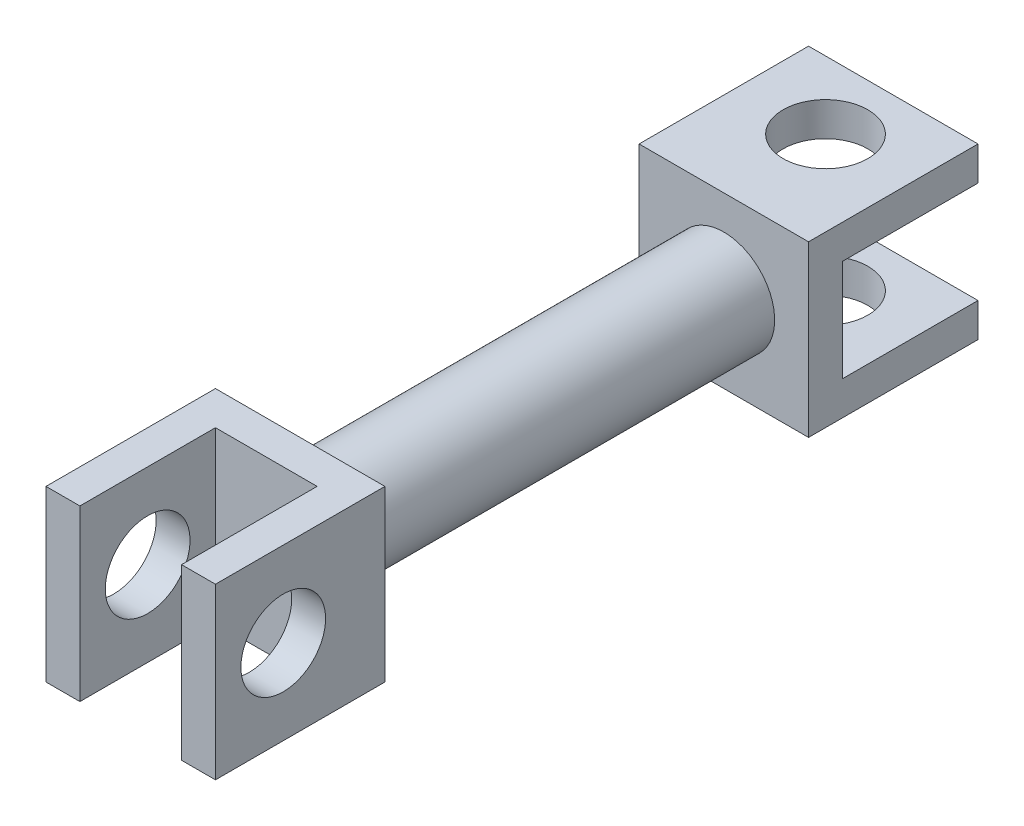
ISO-10303-21;
HEADER;
FILE_DESCRIPTION(('STEP AP214'),'2;1');
FILE_NAME('part.step','',(''),(''),'','','');
FILE_SCHEMA(('AUTOMOTIVE_DESIGN { 1 0 10303 214 1 1 1 1 }'));
ENDSEC;
DATA;
#1=APPLICATION_CONTEXT('core data for automotive mechanical design processes');
#2=APPLICATION_PROTOCOL_DEFINITION('international standard','automotive_design',2000,#1);
#3=PRODUCT_CONTEXT('',#1,'mechanical');
#4=PRODUCT('Part','Part','',(#3));
#5=PRODUCT_RELATED_PRODUCT_CATEGORY('part','',(#4));
#6=PRODUCT_DEFINITION_FORMATION('','',#4);
#7=PRODUCT_DEFINITION_CONTEXT('part definition',#1,'design');
#8=PRODUCT_DEFINITION('design','',#6,#7);
#9=PRODUCT_DEFINITION_SHAPE('','',#8);
#10=(LENGTH_UNIT() NAMED_UNIT(*) SI_UNIT(.MILLI.,.METRE.));
#11=(NAMED_UNIT(*) PLANE_ANGLE_UNIT() SI_UNIT($,.RADIAN.));
#12=(NAMED_UNIT(*) SI_UNIT($,.STERADIAN.) SOLID_ANGLE_UNIT());
#13=UNCERTAINTY_MEASURE_WITH_UNIT(LENGTH_MEASURE(1.E-05),#10,'distance_accuracy_value','');
#14=(GEOMETRIC_REPRESENTATION_CONTEXT(3) GLOBAL_UNCERTAINTY_ASSIGNED_CONTEXT((#13)) GLOBAL_UNIT_ASSIGNED_CONTEXT((#10,
#11,#12)) REPRESENTATION_CONTEXT('',''));
#15=CARTESIAN_POINT('',(0.,0.,0.));
#16=DIRECTION('',(0.,0.,1.));
#17=DIRECTION('',(1.,0.,0.));
#18=AXIS2_PLACEMENT_3D('',#15,#16,#17);
#19=CARTESIAN_POINT('',(0.,0.,-27.));
#20=DIRECTION('',(0.,0.,1.));
#21=DIRECTION('',(1.,0.,0.));
#22=AXIS2_PLACEMENT_3D('',#19,#20,#21);
#23=PLANE('',#22);
#24=DIRECTION('',(-1.,0.,0.));
#25=VECTOR('',#24,1.);
#26=CARTESIAN_POINT('',(5.,3.,-27.));
#27=LINE('',#26,#25);
#28=CARTESIAN_POINT('',(5.,3.,-27.));
#29=VERTEX_POINT('',#28);
#30=CARTESIAN_POINT('',(-5.,3.,-27.));
#31=VERTEX_POINT('',#30);
#32=EDGE_CURVE('E49',#29,#31,#27,.T.);
#33=ORIENTED_EDGE('',*,*,#32,.F.);
#34=DIRECTION('',(0.,-1.,0.));
#35=VECTOR('',#34,1.);
#36=CARTESIAN_POINT('',(5.,-5.,-27.));
#37=LINE('',#36,#35);
#38=CARTESIAN_POINT('',(5.,-3.,-27.));
#39=VERTEX_POINT('',#38);
#40=EDGE_CURVE('E169',#29,#39,#37,.T.);
#41=ORIENTED_EDGE('',*,*,#40,.T.);
#42=DIRECTION('',(1.,0.,0.));
#43=VECTOR('',#42,1.);
#44=CARTESIAN_POINT('',(-5.,-3.,-27.));
#45=LINE('',#44,#43);
#46=CARTESIAN_POINT('',(-5.,-3.,-27.));
#47=VERTEX_POINT('',#46);
#48=EDGE_CURVE('E170',#47,#39,#45,.T.);
#49=ORIENTED_EDGE('',*,*,#48,.F.);
#50=DIRECTION('',(0.,1.,0.));
#51=VECTOR('',#50,1.);
#52=CARTESIAN_POINT('',(-5.,-5.,-27.));
#53=LINE('',#52,#51);
#54=EDGE_CURVE('E54',#47,#31,#53,.T.);
#55=ORIENTED_EDGE('',*,*,#54,.T.);
#56=EDGE_LOOP('',(#33,#41,#49,#55));
#57=FACE_BOUND('',#56,.T.);
#58=ADVANCED_FACE('F32',(#57),#23,.F.);
#59=CARTESIAN_POINT('',(0.,0.,2.));
#60=DIRECTION('',(0.,0.,1.));
#61=DIRECTION('',(1.,0.,0.));
#62=AXIS2_PLACEMENT_3D('',#59,#60,#61);
#63=PLANE('',#62);
#64=DIRECTION('',(1.,0.,0.));
#65=VECTOR('',#64,1.);
#66=CARTESIAN_POINT('',(-5.,-5.,2.));
#67=LINE('',#66,#65);
#68=CARTESIAN_POINT('',(-3.,-5.,2.));
#69=VERTEX_POINT('',#68);
#70=CARTESIAN_POINT('',(3.,-5.,2.));
#71=VERTEX_POINT('',#70);
#72=EDGE_CURVE('E269',#69,#71,#67,.T.);
#73=ORIENTED_EDGE('',*,*,#72,.T.);
#74=DIRECTION('',(0.,-1.,0.));
#75=VECTOR('',#74,1.);
#76=CARTESIAN_POINT('',(3.,5.,2.));
#77=LINE('',#76,#75);
#78=CARTESIAN_POINT('',(3.,5.,2.));
#79=VERTEX_POINT('',#78);
#80=EDGE_CURVE('E227',#79,#71,#77,.T.);
#81=ORIENTED_EDGE('',*,*,#80,.F.);
#82=DIRECTION('',(-1.,0.,0.));
#83=VECTOR('',#82,1.);
#84=CARTESIAN_POINT('',(-5.,5.,2.));
#85=LINE('',#84,#83);
#86=CARTESIAN_POINT('',(-3.,5.,2.));
#87=VERTEX_POINT('',#86);
#88=EDGE_CURVE('E267',#79,#87,#85,.T.);
#89=ORIENTED_EDGE('',*,*,#88,.T.);
#90=DIRECTION('',(0.,1.,0.));
#91=VECTOR('',#90,1.);
#92=CARTESIAN_POINT('',(-3.,-5.,2.));
#93=LINE('',#92,#91);
#94=EDGE_CURVE('E247',#69,#87,#93,.T.);
#95=ORIENTED_EDGE('',*,*,#94,.F.);
#96=EDGE_LOOP('',(#73,#81,#89,#95));
#97=FACE_BOUND('',#96,.T.);
#98=ADVANCED_FACE('F312',(#97),#63,.T.);
#99=CARTESIAN_POINT('',(5.,5.,2.));
#100=DIRECTION('',(-1.,0.,0.));
#101=DIRECTION('',(0.,0.,1.));
#102=AXIS2_PLACEMENT_3D('',#99,#100,#101);
#103=PLANE('',#102);
#104=CARTESIAN_POINT('',(5.,0.,6.));
#105=DIRECTION('',(-1.,0.,0.));
#106=DIRECTION('',(0.,-1.,0.));
#107=AXIS2_PLACEMENT_3D('',#104,#105,#106);
#108=CIRCLE('',#107,2.5);
#109=CARTESIAN_POINT('',(5.,-2.5,6.));
#110=VERTEX_POINT('',#109);
#111=EDGE_CURVE('E218',#110,#110,#108,.T.);
#112=ORIENTED_EDGE('',*,*,#111,.T.);
#113=EDGE_LOOP('',(#112));
#114=FACE_BOUND('',#113,.T.);
#115=DIRECTION('',(0.,1.,0.));
#116=VECTOR('',#115,1.);
#117=CARTESIAN_POINT('',(5.,5.,0.));
#118=LINE('',#117,#116);
#119=CARTESIAN_POINT('',(5.,-5.,0.));
#120=VERTEX_POINT('',#119);
#121=CARTESIAN_POINT('',(5.,5.,0.));
#122=VERTEX_POINT('',#121);
#123=EDGE_CURVE('E266',#120,#122,#118,.T.);
#124=ORIENTED_EDGE('',*,*,#123,.T.);
#125=DIRECTION('',(0.,0.,-1.));
#126=VECTOR('',#125,1.);
#127=CARTESIAN_POINT('',(5.,5.,2.));
#128=LINE('',#127,#126);
#129=CARTESIAN_POINT('',(5.,5.,10.));
#130=VERTEX_POINT('',#129);
#131=EDGE_CURVE('E41',#130,#122,#128,.T.);
#132=ORIENTED_EDGE('',*,*,#131,.F.);
#133=DIRECTION('',(0.,1.,0.));
#134=VECTOR('',#133,1.);
#135=CARTESIAN_POINT('',(5.,5.,10.));
#136=LINE('',#135,#134);
#137=CARTESIAN_POINT('',(5.,-5.,10.));
#138=VERTEX_POINT('',#137);
#139=EDGE_CURVE('E234',#138,#130,#136,.T.);
#140=ORIENTED_EDGE('',*,*,#139,.F.);
#141=DIRECTION('',(0.,0.,-1.));
#142=VECTOR('',#141,1.);
#143=CARTESIAN_POINT('',(5.,-5.,2.));
#144=LINE('',#143,#142);
#145=EDGE_CURVE('E272',#138,#120,#144,.T.);
#146=ORIENTED_EDGE('',*,*,#145,.T.);
#147=EDGE_LOOP('',(#124,#132,#140,#146));
#148=FACE_BOUND('',#147,.T.);
#149=ADVANCED_FACE('F34',(#114,#148),#103,.F.);
#150=CARTESIAN_POINT('',(-5.,5.,2.));
#151=DIRECTION('',(0.,-1.,0.));
#152=DIRECTION('',(0.,0.,-1.));
#153=AXIS2_PLACEMENT_3D('',#150,#151,#152);
#154=PLANE('',#153);
#155=DIRECTION('',(-1.,0.,0.));
#156=VECTOR('',#155,1.);
#157=CARTESIAN_POINT('',(-5.,5.,0.));
#158=LINE('',#157,#156);
#159=CARTESIAN_POINT('',(-5.,5.,0.));
#160=VERTEX_POINT('',#159);
#161=EDGE_CURVE('E275',#122,#160,#158,.T.);
#162=ORIENTED_EDGE('',*,*,#161,.T.);
#163=DIRECTION('',(0.,0.,-1.));
#164=VECTOR('',#163,1.);
#165=CARTESIAN_POINT('',(-5.,5.,2.));
#166=LINE('',#165,#164);
#167=CARTESIAN_POINT('',(-5.,5.,10.));
#168=VERTEX_POINT('',#167);
#169=EDGE_CURVE('E285',#168,#160,#166,.T.);
#170=ORIENTED_EDGE('',*,*,#169,.F.);
#171=DIRECTION('',(-1.,0.,0.));
#172=VECTOR('',#171,1.);
#173=CARTESIAN_POINT('',(-5.,5.,10.));
#174=LINE('',#173,#172);
#175=CARTESIAN_POINT('',(-3.,5.,10.));
#176=VERTEX_POINT('',#175);
#177=EDGE_CURVE('E255',#176,#168,#174,.T.);
#178=ORIENTED_EDGE('',*,*,#177,.F.);
#179=DIRECTION('',(0.,0.,-1.));
#180=VECTOR('',#179,1.);
#181=CARTESIAN_POINT('',(-3.,5.,10.));
#182=LINE('',#181,#180);
#183=EDGE_CURVE('E258',#176,#87,#182,.T.);
#184=ORIENTED_EDGE('',*,*,#183,.T.);
#185=ORIENTED_EDGE('',*,*,#88,.F.);
#186=DIRECTION('',(0.,0.,-1.));
#187=VECTOR('',#186,1.);
#188=CARTESIAN_POINT('',(3.,5.,10.));
#189=LINE('',#188,#187);
#190=CARTESIAN_POINT('',(3.,5.,10.));
#191=VERTEX_POINT('',#190);
#192=EDGE_CURVE('E239',#191,#79,#189,.T.);
#193=ORIENTED_EDGE('',*,*,#192,.F.);
#194=DIRECTION('',(-1.,0.,0.));
#195=VECTOR('',#194,1.);
#196=CARTESIAN_POINT('',(3.,5.,10.));
#197=LINE('',#196,#195);
#198=EDGE_CURVE('E237',#130,#191,#197,.T.);
#199=ORIENTED_EDGE('',*,*,#198,.F.);
#200=ORIENTED_EDGE('',*,*,#131,.T.);
#201=EDGE_LOOP('',(#162,#170,#178,#184,#185,#193,#199,#200));
#202=FACE_BOUND('',#201,.T.);
#203=ADVANCED_FACE('F378',(#202),#154,.F.);
#204=CARTESIAN_POINT('',(-5.,5.,2.));
#205=DIRECTION('',(1.,0.,0.));
#206=DIRECTION('',(0.,1.,0.));
#207=AXIS2_PLACEMENT_3D('',#204,#205,#206);
#208=PLANE('',#207);
#209=CARTESIAN_POINT('',(-5.,0.,6.));
#210=DIRECTION('',(-1.,0.,0.));
#211=DIRECTION('',(0.,-1.,0.));
#212=AXIS2_PLACEMENT_3D('',#209,#210,#211);
#213=CIRCLE('',#212,2.5);
#214=CARTESIAN_POINT('',(-5.,-2.5,6.));
#215=VERTEX_POINT('',#214);
#216=EDGE_CURVE('E216',#215,#215,#213,.T.);
#217=ORIENTED_EDGE('',*,*,#216,.F.);
#218=EDGE_LOOP('',(#217));
#219=FACE_BOUND('',#218,.T.);
#220=DIRECTION('',(0.,-1.,0.));
#221=VECTOR('',#220,1.);
#222=CARTESIAN_POINT('',(-5.,5.,0.));
#223=LINE('',#222,#221);
#224=CARTESIAN_POINT('',(-5.,-5.,0.));
#225=VERTEX_POINT('',#224);
#226=EDGE_CURVE('E277',#160,#225,#223,.T.);
#227=ORIENTED_EDGE('',*,*,#226,.T.);
#228=DIRECTION('',(0.,0.,-1.));
#229=VECTOR('',#228,1.);
#230=CARTESIAN_POINT('',(-5.,-5.,2.));
#231=LINE('',#230,#229);
#232=CARTESIAN_POINT('',(-5.,-5.,10.));
#233=VERTEX_POINT('',#232);
#234=EDGE_CURVE('E282',#233,#225,#231,.T.);
#235=ORIENTED_EDGE('',*,*,#234,.F.);
#236=DIRECTION('',(0.,-1.,0.));
#237=VECTOR('',#236,1.);
#238=CARTESIAN_POINT('',(-5.,-5.,10.));
#239=LINE('',#238,#237);
#240=EDGE_CURVE('E248',#168,#233,#239,.T.);
#241=ORIENTED_EDGE('',*,*,#240,.F.);
#242=ORIENTED_EDGE('',*,*,#169,.T.);
#243=EDGE_LOOP('',(#227,#235,#241,#242));
#244=FACE_BOUND('',#243,.T.);
#245=ADVANCED_FACE('F376',(#219,#244),#208,.F.);
#246=CARTESIAN_POINT('',(-5.,-5.,2.));
#247=DIRECTION('',(0.,1.,0.));
#248=DIRECTION('',(0.,0.,1.));
#249=AXIS2_PLACEMENT_3D('',#246,#247,#248);
#250=PLANE('',#249);
#251=DIRECTION('',(1.,0.,0.));
#252=VECTOR('',#251,1.);
#253=CARTESIAN_POINT('',(-5.,-5.,0.));
#254=LINE('',#253,#252);
#255=EDGE_CURVE('E270',#225,#120,#254,.T.);
#256=ORIENTED_EDGE('',*,*,#255,.T.);
#257=ORIENTED_EDGE('',*,*,#145,.F.);
#258=DIRECTION('',(1.,0.,0.));
#259=VECTOR('',#258,1.);
#260=CARTESIAN_POINT('',(3.,-5.,10.));
#261=LINE('',#260,#259);
#262=CARTESIAN_POINT('',(3.,-5.,10.));
#263=VERTEX_POINT('',#262);
#264=EDGE_CURVE('E231',#263,#138,#261,.T.);
#265=ORIENTED_EDGE('',*,*,#264,.F.);
#266=DIRECTION('',(0.,0.,-1.));
#267=VECTOR('',#266,1.);
#268=CARTESIAN_POINT('',(3.,-5.,10.));
#269=LINE('',#268,#267);
#270=EDGE_CURVE('E244',#263,#71,#269,.T.);
#271=ORIENTED_EDGE('',*,*,#270,.T.);
#272=ORIENTED_EDGE('',*,*,#72,.F.);
#273=DIRECTION('',(0.,0.,-1.));
#274=VECTOR('',#273,1.);
#275=CARTESIAN_POINT('',(-3.,-5.,10.));
#276=LINE('',#275,#274);
#277=CARTESIAN_POINT('',(-3.,-5.,10.));
#278=VERTEX_POINT('',#277);
#279=EDGE_CURVE('E263',#278,#69,#276,.T.);
#280=ORIENTED_EDGE('',*,*,#279,.F.);
#281=DIRECTION('',(1.,0.,0.));
#282=VECTOR('',#281,1.);
#283=CARTESIAN_POINT('',(-5.,-5.,10.));
#284=LINE('',#283,#282);
#285=EDGE_CURVE('E251',#233,#278,#284,.T.);
#286=ORIENTED_EDGE('',*,*,#285,.F.);
#287=ORIENTED_EDGE('',*,*,#234,.T.);
#288=EDGE_LOOP('',(#256,#257,#265,#271,#272,#280,#286,#287));
#289=FACE_BOUND('',#288,.T.);
#290=ADVANCED_FACE('F352',(#289),#250,.F.);
#291=CARTESIAN_POINT('',(0.,0.,0.));
#292=DIRECTION('',(0.,0.,1.));
#293=DIRECTION('',(1.,0.,0.));
#294=AXIS2_PLACEMENT_3D('',#291,#292,#293);
#295=PLANE('',#294);
#296=CARTESIAN_POINT('',(0.,0.,0.));
#297=DIRECTION('',(0.,0.,-1.));
#298=DIRECTION('',(-1.,0.,0.));
#299=AXIS2_PLACEMENT_3D('',#296,#297,#298);
#300=CIRCLE('',#299,3.);
#301=CARTESIAN_POINT('',(-3.,0.,0.));
#302=VERTEX_POINT('',#301);
#303=EDGE_CURVE('E11',#302,#302,#300,.T.);
#304=ORIENTED_EDGE('',*,*,#303,.F.);
#305=EDGE_LOOP('',(#304));
#306=FACE_BOUND('',#305,.T.);
#307=ORIENTED_EDGE('',*,*,#123,.F.);
#308=ORIENTED_EDGE('',*,*,#255,.F.);
#309=ORIENTED_EDGE('',*,*,#226,.F.);
#310=ORIENTED_EDGE('',*,*,#161,.F.);
#311=EDGE_LOOP('',(#307,#308,#309,#310));
#312=FACE_BOUND('',#311,.T.);
#313=ADVANCED_FACE('F348',(#306,#312),#295,.F.);
#314=CARTESIAN_POINT('',(-3.,-5.,10.));
#315=DIRECTION('',(-1.,0.,0.));
#316=DIRECTION('',(0.,0.,1.));
#317=AXIS2_PLACEMENT_3D('',#314,#315,#316);
#318=PLANE('',#317);
#319=CARTESIAN_POINT('',(-3.,0.,6.));
#320=DIRECTION('',(-1.,0.,0.));
#321=DIRECTION('',(0.,0.,1.));
#322=AXIS2_PLACEMENT_3D('',#319,#320,#321);
#323=CIRCLE('',#322,2.5);
#324=CARTESIAN_POINT('',(-3.,0.,8.5));
#325=VERTEX_POINT('',#324);
#326=EDGE_CURVE('E224',#325,#325,#323,.T.);
#327=ORIENTED_EDGE('',*,*,#326,.T.);
#328=EDGE_LOOP('',(#327));
#329=FACE_BOUND('',#328,.T.);
#330=ORIENTED_EDGE('',*,*,#94,.T.);
#331=ORIENTED_EDGE('',*,*,#183,.F.);
#332=DIRECTION('',(0.,1.,0.));
#333=VECTOR('',#332,1.);
#334=CARTESIAN_POINT('',(-3.,-5.,10.));
#335=LINE('',#334,#333);
#336=EDGE_CURVE('E253',#278,#176,#335,.T.);
#337=ORIENTED_EDGE('',*,*,#336,.F.);
#338=ORIENTED_EDGE('',*,*,#279,.T.);
#339=EDGE_LOOP('',(#330,#331,#337,#338));
#340=FACE_BOUND('',#339,.T.);
#341=ADVANCED_FACE('F351',(#329,#340),#318,.F.);
#342=CARTESIAN_POINT('',(0.,0.,10.));
#343=DIRECTION('',(0.,0.,-1.));
#344=DIRECTION('',(-1.,0.,0.));
#345=AXIS2_PLACEMENT_3D('',#342,#343,#344);
#346=PLANE('',#345);
#347=ORIENTED_EDGE('',*,*,#240,.T.);
#348=ORIENTED_EDGE('',*,*,#285,.T.);
#349=ORIENTED_EDGE('',*,*,#336,.T.);
#350=ORIENTED_EDGE('',*,*,#177,.T.);
#351=EDGE_LOOP('',(#347,#348,#349,#350));
#352=FACE_BOUND('',#351,.T.);
#353=ADVANCED_FACE('F373',(#352),#346,.F.);
#354=CARTESIAN_POINT('',(3.,5.,10.));
#355=DIRECTION('',(1.,0.,0.));
#356=DIRECTION('',(0.,1.,0.));
#357=AXIS2_PLACEMENT_3D('',#354,#355,#356);
#358=PLANE('',#357);
#359=CARTESIAN_POINT('',(3.,0.,6.));
#360=DIRECTION('',(1.,0.,0.));
#361=DIRECTION('',(0.,1.,0.));
#362=AXIS2_PLACEMENT_3D('',#359,#360,#361);
#363=CIRCLE('',#362,2.5);
#364=CARTESIAN_POINT('',(3.,2.5,6.));
#365=VERTEX_POINT('',#364);
#366=EDGE_CURVE('E221',#365,#365,#363,.T.);
#367=ORIENTED_EDGE('',*,*,#366,.T.);
#368=EDGE_LOOP('',(#367));
#369=FACE_BOUND('',#368,.T.);
#370=ORIENTED_EDGE('',*,*,#80,.T.);
#371=ORIENTED_EDGE('',*,*,#270,.F.);
#372=DIRECTION('',(0.,-1.,0.));
#373=VECTOR('',#372,1.);
#374=CARTESIAN_POINT('',(3.,5.,10.));
#375=LINE('',#374,#373);
#376=EDGE_CURVE('E228',#191,#263,#375,.T.);
#377=ORIENTED_EDGE('',*,*,#376,.F.);
#378=ORIENTED_EDGE('',*,*,#192,.T.);
#379=EDGE_LOOP('',(#370,#371,#377,#378));
#380=FACE_BOUND('',#379,.T.);
#381=ADVANCED_FACE('F292',(#369,#380),#358,.F.);
#382=CARTESIAN_POINT('',(0.,0.,10.));
#383=DIRECTION('',(0.,0.,1.));
#384=DIRECTION('',(1.,0.,0.));
#385=AXIS2_PLACEMENT_3D('',#382,#383,#384);
#386=PLANE('',#385);
#387=ORIENTED_EDGE('',*,*,#376,.T.);
#388=ORIENTED_EDGE('',*,*,#264,.T.);
#389=ORIENTED_EDGE('',*,*,#139,.T.);
#390=ORIENTED_EDGE('',*,*,#198,.T.);
#391=EDGE_LOOP('',(#387,#388,#389,#390));
#392=FACE_BOUND('',#391,.T.);
#393=ADVANCED_FACE('F298',(#392),#386,.T.);
#394=CARTESIAN_POINT('',(5.,0.,6.));
#395=DIRECTION('',(-1.,0.,0.));
#396=DIRECTION('',(0.,-1.,0.));
#397=AXIS2_PLACEMENT_3D('',#394,#395,#396);
#398=CYLINDRICAL_SURFACE('',#397,2.5);
#399=ORIENTED_EDGE('',*,*,#111,.F.);
#400=EDGE_LOOP('',(#399));
#401=FACE_BOUND('',#400,.T.);
#402=ORIENTED_EDGE('',*,*,#366,.F.);
#403=EDGE_LOOP('',(#402));
#404=FACE_BOUND('',#403,.T.);
#405=ADVANCED_FACE('F295',(#401,#404),#398,.F.);
#406=ORIENTED_EDGE('',*,*,#216,.T.);
#407=EDGE_LOOP('',(#406));
#408=FACE_BOUND('',#407,.T.);
#409=ORIENTED_EDGE('',*,*,#326,.F.);
#410=EDGE_LOOP('',(#409));
#411=FACE_BOUND('',#410,.T.);
#412=ADVANCED_FACE('F297',(#408,#411),#398,.F.);
#413=CARTESIAN_POINT('',(0.,0.,-25.));
#414=DIRECTION('',(0.,0.,1.));
#415=DIRECTION('',(1.,0.,0.));
#416=AXIS2_PLACEMENT_3D('',#413,#414,#415);
#417=CYLINDRICAL_SURFACE('',#416,3.);
#418=CARTESIAN_POINT('',(0.,0.,-25.));
#419=DIRECTION('',(0.,0.,-1.));
#420=DIRECTION('',(-1.,0.,0.));
#421=AXIS2_PLACEMENT_3D('',#418,#419,#420);
#422=CIRCLE('',#421,3.);
#423=CARTESIAN_POINT('',(-3.,0.,-25.));
#424=VERTEX_POINT('',#423);
#425=EDGE_CURVE('E214',#424,#424,#422,.T.);
#426=ORIENTED_EDGE('',*,*,#425,.F.);
#427=EDGE_LOOP('',(#426));
#428=FACE_BOUND('',#427,.T.);
#429=ORIENTED_EDGE('',*,*,#303,.T.);
#430=EDGE_LOOP('',(#429));
#431=FACE_BOUND('',#430,.T.);
#432=ADVANCED_FACE('F305',(#428,#431),#417,.T.);
#433=CARTESIAN_POINT('',(5.,-5.,-27.));
#434=DIRECTION('',(-1.,0.,0.));
#435=DIRECTION('',(0.,0.,1.));
#436=AXIS2_PLACEMENT_3D('',#433,#434,#435);
#437=PLANE('',#436);
#438=DIRECTION('',(0.,-1.,0.));
#439=VECTOR('',#438,1.);
#440=CARTESIAN_POINT('',(5.,-5.,-25.));
#441=LINE('',#440,#439);
#442=CARTESIAN_POINT('',(5.,5.,-25.));
#443=VERTEX_POINT('',#442);
#444=CARTESIAN_POINT('',(5.,-5.,-25.));
#445=VERTEX_POINT('',#444);
#446=EDGE_CURVE('E193',#443,#445,#441,.T.);
#447=ORIENTED_EDGE('',*,*,#446,.T.);
#448=DIRECTION('',(0.,0.,1.));
#449=VECTOR('',#448,1.);
#450=CARTESIAN_POINT('',(5.,-5.,-27.));
#451=LINE('',#450,#449);
#452=CARTESIAN_POINT('',(5.,-5.,-35.));
#453=VERTEX_POINT('',#452);
#454=EDGE_CURVE('E211',#453,#445,#451,.T.);
#455=ORIENTED_EDGE('',*,*,#454,.F.);
#456=DIRECTION('',(0.,-1.,0.));
#457=VECTOR('',#456,1.);
#458=CARTESIAN_POINT('',(5.,-5.,-35.));
#459=LINE('',#458,#457);
#460=CARTESIAN_POINT('',(5.,-3.,-35.));
#461=VERTEX_POINT('',#460);
#462=EDGE_CURVE('E182',#461,#453,#459,.T.);
#463=ORIENTED_EDGE('',*,*,#462,.F.);
#464=DIRECTION('',(0.,0.,1.));
#465=VECTOR('',#464,1.);
#466=CARTESIAN_POINT('',(5.,-3.,-35.));
#467=LINE('',#466,#465);
#468=EDGE_CURVE('E187',#461,#39,#467,.T.);
#469=ORIENTED_EDGE('',*,*,#468,.T.);
#470=ORIENTED_EDGE('',*,*,#40,.F.);
#471=DIRECTION('',(0.,0.,1.));
#472=VECTOR('',#471,1.);
#473=CARTESIAN_POINT('',(5.,3.,-35.));
#474=LINE('',#473,#472);
#475=CARTESIAN_POINT('',(5.,3.,-35.));
#476=VERTEX_POINT('',#475);
#477=EDGE_CURVE('E149',#476,#29,#474,.T.);
#478=ORIENTED_EDGE('',*,*,#477,.F.);
#479=DIRECTION('',(0.,-1.,0.));
#480=VECTOR('',#479,1.);
#481=CARTESIAN_POINT('',(5.,3.,-35.));
#482=LINE('',#481,#480);
#483=CARTESIAN_POINT('',(5.,5.,-35.));
#484=VERTEX_POINT('',#483);
#485=EDGE_CURVE('E156',#484,#476,#482,.T.);
#486=ORIENTED_EDGE('',*,*,#485,.F.);
#487=DIRECTION('',(0.,0.,1.));
#488=VECTOR('',#487,1.);
#489=CARTESIAN_POINT('',(5.,5.,-27.));
#490=LINE('',#489,#488);
#491=EDGE_CURVE('E197',#484,#443,#490,.T.);
#492=ORIENTED_EDGE('',*,*,#491,.T.);
#493=EDGE_LOOP('',(#447,#455,#463,#469,#470,#478,#486,#492));
#494=FACE_BOUND('',#493,.T.);
#495=ADVANCED_FACE('F167',(#494),#437,.F.);
#496=CARTESIAN_POINT('',(5.,-5.,-27.));
#497=DIRECTION('',(0.,1.,0.));
#498=DIRECTION('',(0.,0.,1.));
#499=AXIS2_PLACEMENT_3D('',#496,#497,#498);
#500=PLANE('',#499);
#501=CARTESIAN_POINT('',(0.,-5.,-31.));
#502=DIRECTION('',(0.,-1.,0.));
#503=DIRECTION('',(0.,0.,-1.));
#504=AXIS2_PLACEMENT_3D('',#501,#502,#503);
#505=CIRCLE('',#504,2.5);
#506=CARTESIAN_POINT('',(0.,-5.,-33.5));
#507=VERTEX_POINT('',#506);
#508=EDGE_CURVE('E571',#507,#507,#505,.T.);
#509=ORIENTED_EDGE('',*,*,#508,.F.);
#510=EDGE_LOOP('',(#509));
#511=FACE_BOUND('',#510,.T.);
#512=DIRECTION('',(-1.,0.,0.));
#513=VECTOR('',#512,1.);
#514=CARTESIAN_POINT('',(5.,-5.,-25.));
#515=LINE('',#514,#513);
#516=CARTESIAN_POINT('',(-5.,-5.,-25.));
#517=VERTEX_POINT('',#516);
#518=EDGE_CURVE('E199',#445,#517,#515,.T.);
#519=ORIENTED_EDGE('',*,*,#518,.T.);
#520=DIRECTION('',(0.,0.,1.));
#521=VECTOR('',#520,1.);
#522=CARTESIAN_POINT('',(-5.,-5.,-27.));
#523=LINE('',#522,#521);
#524=CARTESIAN_POINT('',(-5.,-5.,-35.));
#525=VERTEX_POINT('',#524);
#526=EDGE_CURVE('E208',#525,#517,#523,.T.);
#527=ORIENTED_EDGE('',*,*,#526,.F.);
#528=DIRECTION('',(-1.,0.,0.));
#529=VECTOR('',#528,1.);
#530=CARTESIAN_POINT('',(-5.,-5.,-35.));
#531=LINE('',#530,#529);
#532=EDGE_CURVE('E185',#453,#525,#531,.T.);
#533=ORIENTED_EDGE('',*,*,#532,.F.);
#534=ORIENTED_EDGE('',*,*,#454,.T.);
#535=EDGE_LOOP('',(#519,#527,#533,#534));
#536=FACE_BOUND('',#535,.T.);
#537=ADVANCED_FACE('F334',(#511,#536),#500,.F.);
#538=CARTESIAN_POINT('',(-5.,-5.,-27.));
#539=DIRECTION('',(1.,0.,0.));
#540=DIRECTION('',(0.,0.,-1.));
#541=AXIS2_PLACEMENT_3D('',#538,#539,#540);
#542=PLANE('',#541);
#543=DIRECTION('',(0.,1.,0.));
#544=VECTOR('',#543,1.);
#545=CARTESIAN_POINT('',(-5.,-5.,-25.));
#546=LINE('',#545,#544);
#547=CARTESIAN_POINT('',(-5.,5.,-25.));
#548=VERTEX_POINT('',#547);
#549=EDGE_CURVE('E201',#517,#548,#546,.T.);
#550=ORIENTED_EDGE('',*,*,#549,.T.);
#551=DIRECTION('',(0.,0.,1.));
#552=VECTOR('',#551,1.);
#553=CARTESIAN_POINT('',(-5.,5.,-27.));
#554=LINE('',#553,#552);
#555=CARTESIAN_POINT('',(-5.,5.,-35.));
#556=VERTEX_POINT('',#555);
#557=EDGE_CURVE('E205',#556,#548,#554,.T.);
#558=ORIENTED_EDGE('',*,*,#557,.F.);
#559=DIRECTION('',(0.,1.,0.));
#560=VECTOR('',#559,1.);
#561=CARTESIAN_POINT('',(-5.,3.,-35.));
#562=LINE('',#561,#560);
#563=CARTESIAN_POINT('',(-5.,3.,-35.));
#564=VERTEX_POINT('',#563);
#565=EDGE_CURVE('E155',#564,#556,#562,.T.);
#566=ORIENTED_EDGE('',*,*,#565,.F.);
#567=DIRECTION('',(0.,0.,1.));
#568=VECTOR('',#567,1.);
#569=CARTESIAN_POINT('',(-5.,3.,-35.));
#570=LINE('',#569,#568);
#571=EDGE_CURVE('E151',#564,#31,#570,.T.);
#572=ORIENTED_EDGE('',*,*,#571,.T.);
#573=ORIENTED_EDGE('',*,*,#54,.F.);
#574=DIRECTION('',(0.,0.,1.));
#575=VECTOR('',#574,1.);
#576=CARTESIAN_POINT('',(-5.,-3.,-35.));
#577=LINE('',#576,#575);
#578=CARTESIAN_POINT('',(-5.,-3.,-35.));
#579=VERTEX_POINT('',#578);
#580=EDGE_CURVE('E190',#579,#47,#577,.T.);
#581=ORIENTED_EDGE('',*,*,#580,.F.);
#582=DIRECTION('',(0.,1.,0.));
#583=VECTOR('',#582,1.);
#584=CARTESIAN_POINT('',(-5.,-5.,-35.));
#585=LINE('',#584,#583);
#586=EDGE_CURVE('E173',#525,#579,#585,.T.);
#587=ORIENTED_EDGE('',*,*,#586,.F.);
#588=ORIENTED_EDGE('',*,*,#526,.T.);
#589=EDGE_LOOP('',(#550,#558,#566,#572,#573,#581,#587,#588));
#590=FACE_BOUND('',#589,.T.);
#591=ADVANCED_FACE('F330',(#590),#542,.F.);
#592=CARTESIAN_POINT('',(5.,5.,-27.));
#593=DIRECTION('',(0.,-1.,0.));
#594=DIRECTION('',(0.,0.,-1.));
#595=AXIS2_PLACEMENT_3D('',#592,#593,#594);
#596=PLANE('',#595);
#597=CARTESIAN_POINT('',(0.,5.,-31.));
#598=DIRECTION('',(0.,-1.,0.));
#599=DIRECTION('',(0.,0.,-1.));
#600=AXIS2_PLACEMENT_3D('',#597,#598,#599);
#601=CIRCLE('',#600,2.5);
#602=CARTESIAN_POINT('',(0.,5.,-33.5));
#603=VERTEX_POINT('',#602);
#604=EDGE_CURVE('E577',#603,#603,#601,.T.);
#605=ORIENTED_EDGE('',*,*,#604,.T.);
#606=EDGE_LOOP('',(#605));
#607=FACE_BOUND('',#606,.T.);
#608=DIRECTION('',(1.,0.,0.));
#609=VECTOR('',#608,1.);
#610=CARTESIAN_POINT('',(5.,5.,-25.));
#611=LINE('',#610,#609);
#612=EDGE_CURVE('E195',#548,#443,#611,.T.);
#613=ORIENTED_EDGE('',*,*,#612,.T.);
#614=ORIENTED_EDGE('',*,*,#491,.F.);
#615=DIRECTION('',(1.,0.,0.));
#616=VECTOR('',#615,1.);
#617=CARTESIAN_POINT('',(5.,5.,-35.));
#618=LINE('',#617,#616);
#619=EDGE_CURVE('E162',#556,#484,#618,.T.);
#620=ORIENTED_EDGE('',*,*,#619,.F.);
#621=ORIENTED_EDGE('',*,*,#557,.T.);
#622=EDGE_LOOP('',(#613,#614,#620,#621));
#623=FACE_BOUND('',#622,.T.);
#624=ADVANCED_FACE('F326',(#607,#623),#596,.F.);
#625=CARTESIAN_POINT('',(0.,0.,-25.));
#626=DIRECTION('',(0.,0.,1.));
#627=DIRECTION('',(1.,0.,0.));
#628=AXIS2_PLACEMENT_3D('',#625,#626,#627);
#629=PLANE('',#628);
#630=ORIENTED_EDGE('',*,*,#425,.T.);
#631=EDGE_LOOP('',(#630));
#632=FACE_BOUND('',#631,.T.);
#633=ORIENTED_EDGE('',*,*,#446,.F.);
#634=ORIENTED_EDGE('',*,*,#612,.F.);
#635=ORIENTED_EDGE('',*,*,#549,.F.);
#636=ORIENTED_EDGE('',*,*,#518,.F.);
#637=EDGE_LOOP('',(#633,#634,#635,#636));
#638=FACE_BOUND('',#637,.T.);
#639=ADVANCED_FACE('F323',(#632,#638),#629,.T.);
#640=CARTESIAN_POINT('',(-5.,-3.,-35.));
#641=DIRECTION('',(0.,-1.,0.));
#642=DIRECTION('',(1.,0.,0.));
#643=AXIS2_PLACEMENT_3D('',#640,#641,#642);
#644=PLANE('',#643);
#645=CARTESIAN_POINT('',(0.,-3.,-31.));
#646=DIRECTION('',(0.,-1.,0.));
#647=DIRECTION('',(1.,0.,0.));
#648=AXIS2_PLACEMENT_3D('',#645,#646,#647);
#649=CIRCLE('',#648,2.5);
#650=CARTESIAN_POINT('',(2.5,-3.,-31.));
#651=VERTEX_POINT('',#650);
#652=EDGE_CURVE('E574',#651,#651,#649,.T.);
#653=ORIENTED_EDGE('',*,*,#652,.T.);
#654=EDGE_LOOP('',(#653));
#655=FACE_BOUND('',#654,.T.);
#656=ORIENTED_EDGE('',*,*,#48,.T.);
#657=ORIENTED_EDGE('',*,*,#468,.F.);
#658=DIRECTION('',(1.,0.,0.));
#659=VECTOR('',#658,1.);
#660=CARTESIAN_POINT('',(-5.,-3.,-35.));
#661=LINE('',#660,#659);
#662=EDGE_CURVE('E180',#579,#461,#661,.T.);
#663=ORIENTED_EDGE('',*,*,#662,.F.);
#664=ORIENTED_EDGE('',*,*,#580,.T.);
#665=EDGE_LOOP('',(#656,#657,#663,#664));
#666=FACE_BOUND('',#665,.T.);
#667=ADVANCED_FACE('F321',(#655,#666),#644,.F.);
#668=CARTESIAN_POINT('',(0.,0.,-35.));
#669=DIRECTION('',(0.,0.,-1.));
#670=DIRECTION('',(-1.,0.,0.));
#671=AXIS2_PLACEMENT_3D('',#668,#669,#670);
#672=PLANE('',#671);
#673=ORIENTED_EDGE('',*,*,#586,.T.);
#674=ORIENTED_EDGE('',*,*,#662,.T.);
#675=ORIENTED_EDGE('',*,*,#462,.T.);
#676=ORIENTED_EDGE('',*,*,#532,.T.);
#677=EDGE_LOOP('',(#673,#674,#675,#676));
#678=FACE_BOUND('',#677,.T.);
#679=ADVANCED_FACE('F506',(#678),#672,.T.);
#680=CARTESIAN_POINT('',(5.,3.,-35.));
#681=DIRECTION('',(0.,1.,0.));
#682=DIRECTION('',(0.,0.,1.));
#683=AXIS2_PLACEMENT_3D('',#680,#681,#682);
#684=PLANE('',#683);
#685=CARTESIAN_POINT('',(0.,3.,-31.));
#686=DIRECTION('',(0.,1.,0.));
#687=DIRECTION('',(0.,0.,1.));
#688=AXIS2_PLACEMENT_3D('',#685,#686,#687);
#689=CIRCLE('',#688,2.5);
#690=CARTESIAN_POINT('',(0.,3.,-28.5));
#691=VERTEX_POINT('',#690);
#692=EDGE_CURVE('E36',#691,#691,#689,.T.);
#693=ORIENTED_EDGE('',*,*,#692,.T.);
#694=EDGE_LOOP('',(#693));
#695=FACE_BOUND('',#694,.T.);
#696=ORIENTED_EDGE('',*,*,#32,.T.);
#697=ORIENTED_EDGE('',*,*,#571,.F.);
#698=DIRECTION('',(-1.,0.,0.));
#699=VECTOR('',#698,1.);
#700=CARTESIAN_POINT('',(5.,3.,-35.));
#701=LINE('',#700,#699);
#702=EDGE_CURVE('E145',#476,#564,#701,.T.);
#703=ORIENTED_EDGE('',*,*,#702,.F.);
#704=ORIENTED_EDGE('',*,*,#477,.T.);
#705=EDGE_LOOP('',(#696,#697,#703,#704));
#706=FACE_BOUND('',#705,.T.);
#707=ADVANCED_FACE('F147',(#695,#706),#684,.F.);
#708=CARTESIAN_POINT('',(0.,0.,-35.));
#709=DIRECTION('',(0.,0.,1.));
#710=DIRECTION('',(1.,0.,0.));
#711=AXIS2_PLACEMENT_3D('',#708,#709,#710);
#712=PLANE('',#711);
#713=ORIENTED_EDGE('',*,*,#485,.T.);
#714=ORIENTED_EDGE('',*,*,#702,.T.);
#715=ORIENTED_EDGE('',*,*,#565,.T.);
#716=ORIENTED_EDGE('',*,*,#619,.T.);
#717=EDGE_LOOP('',(#713,#714,#715,#716));
#718=FACE_BOUND('',#717,.T.);
#719=ADVANCED_FACE('F160',(#718),#712,.F.);
#720=CARTESIAN_POINT('',(0.,5.,-31.));
#721=DIRECTION('',(0.,-1.,0.));
#722=DIRECTION('',(0.,0.,-1.));
#723=AXIS2_PLACEMENT_3D('',#720,#721,#722);
#724=CYLINDRICAL_SURFACE('',#723,2.5);
#725=ORIENTED_EDGE('',*,*,#604,.F.);
#726=EDGE_LOOP('',(#725));
#727=FACE_BOUND('',#726,.T.);
#728=ORIENTED_EDGE('',*,*,#692,.F.);
#729=EDGE_LOOP('',(#728));
#730=FACE_BOUND('',#729,.T.);
#731=ADVANCED_FACE('F522',(#727,#730),#724,.F.);
#732=ORIENTED_EDGE('',*,*,#508,.T.);
#733=EDGE_LOOP('',(#732));
#734=FACE_BOUND('',#733,.T.);
#735=ORIENTED_EDGE('',*,*,#652,.F.);
#736=EDGE_LOOP('',(#735));
#737=FACE_BOUND('',#736,.T.);
#738=ADVANCED_FACE('F555',(#734,#737),#724,.F.);
#739=CLOSED_SHELL('',(#58,#98,#149,#203,#245,#290,#313,#341,#353,#381,#393,#405,#412,#432,#495,
#537,#591,#624,#639,#667,#679,#707,#719,#731,#738));
#740=MANIFOLD_SOLID_BREP('B2',#739);
#741=ADVANCED_BREP_SHAPE_REPRESENTATION('',(#18,#740),#14);
#742=SHAPE_DEFINITION_REPRESENTATION(#9,#741);
ENDSEC;
END-ISO-10303-21;
